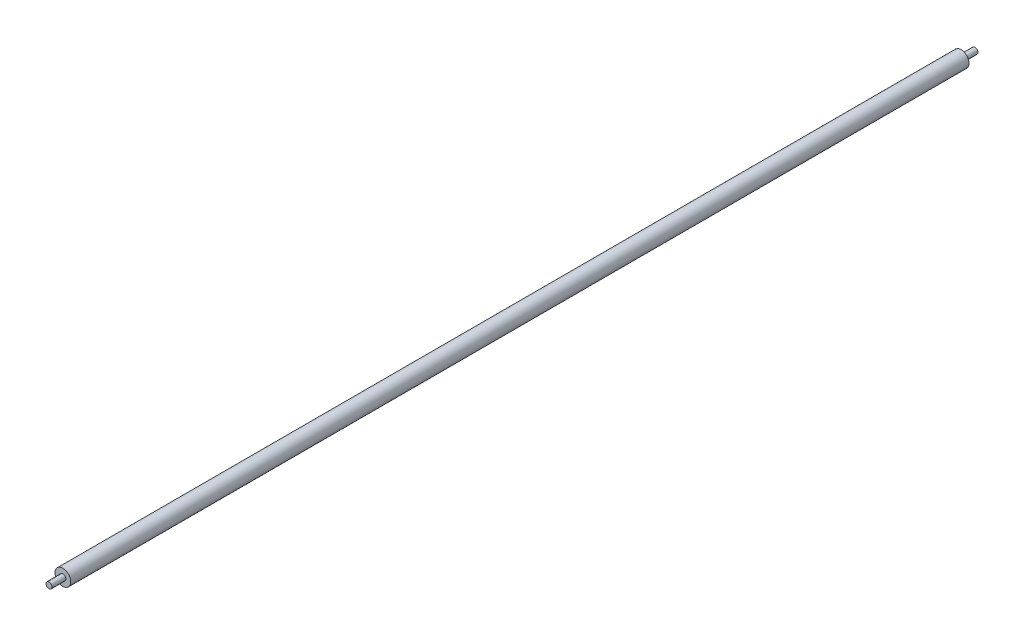
ISO-10303-21;
HEADER;
FILE_DESCRIPTION(('STEP AP214'),'2;1');
FILE_NAME('part.step','',(''),(''),'','','');
FILE_SCHEMA(('AUTOMOTIVE_DESIGN { 1 0 10303 214 1 1 1 1 }'));
ENDSEC;
DATA;
#1=APPLICATION_CONTEXT('core data for automotive mechanical design processes');
#2=APPLICATION_PROTOCOL_DEFINITION('international standard','automotive_design',2000,#1);
#3=PRODUCT_CONTEXT('',#1,'mechanical');
#4=PRODUCT('Part','Part','',(#3));
#5=PRODUCT_RELATED_PRODUCT_CATEGORY('part','',(#4));
#6=PRODUCT_DEFINITION_FORMATION('','',#4);
#7=PRODUCT_DEFINITION_CONTEXT('part definition',#1,'design');
#8=PRODUCT_DEFINITION('design','',#6,#7);
#9=PRODUCT_DEFINITION_SHAPE('','',#8);
#10=(LENGTH_UNIT() NAMED_UNIT(*) SI_UNIT(.MILLI.,.METRE.));
#11=(NAMED_UNIT(*) PLANE_ANGLE_UNIT() SI_UNIT($,.RADIAN.));
#12=(NAMED_UNIT(*) SI_UNIT($,.STERADIAN.) SOLID_ANGLE_UNIT());
#13=UNCERTAINTY_MEASURE_WITH_UNIT(LENGTH_MEASURE(1.E-05),#10,'distance_accuracy_value','');
#14=(GEOMETRIC_REPRESENTATION_CONTEXT(3) GLOBAL_UNCERTAINTY_ASSIGNED_CONTEXT((#13)) GLOBAL_UNIT_ASSIGNED_CONTEXT((#10,
#11,#12)) REPRESENTATION_CONTEXT('',''));
#15=CARTESIAN_POINT('',(0.,0.,0.));
#16=DIRECTION('',(0.,0.,1.));
#17=DIRECTION('',(1.,0.,0.));
#18=AXIS2_PLACEMENT_3D('',#15,#16,#17);
#19=CARTESIAN_POINT('',(0.,0.,102.404163056034));
#20=DIRECTION('',(0.,0.,-1.));
#21=DIRECTION('',(-1.,0.,0.));
#22=AXIS2_PLACEMENT_3D('',#19,#20,#21);
#23=CYLINDRICAL_SURFACE('',#22,0.85);
#24=CARTESIAN_POINT('',(0.,0.,1.5));
#25=DIRECTION('',(0.,0.,1.));
#26=DIRECTION('',(1.,0.,0.));
#27=AXIS2_PLACEMENT_3D('',#24,#25,#26);
#28=CIRCLE('',#27,0.85);
#29=CARTESIAN_POINT('',(-0.85,0.,1.49999999999999));
#30=VERTEX_POINT('',#29);
#31=EDGE_CURVE('E51',#30,#30,#28,.T.);
#32=CARTESIAN_POINT('',(0.,0.,98.5));
#33=DIRECTION('',(0.,0.,1.));
#34=DIRECTION('',(1.,0.,0.));
#35=AXIS2_PLACEMENT_3D('',#32,#33,#34);
#36=CIRCLE('',#35,0.85);
#37=CARTESIAN_POINT('',(-0.85,0.,98.5));
#38=VERTEX_POINT('',#37);
#39=EDGE_CURVE('E11',#38,#38,#36,.T.);
#40=CARTESIAN_POINT('',(-0.85,0.,1.49999999999999));
#41=CARTESIAN_POINT('',(-0.85,0.,2.51041666666665));
#42=CARTESIAN_POINT('',(-0.85,0.,3.52083333333332));
#43=CARTESIAN_POINT('',(-0.85,0.,5.54166666666665));
#44=CARTESIAN_POINT('',(-0.85,0.,6.55208333333332));
#45=CARTESIAN_POINT('',(-0.85,0.,8.57291666666665));
#46=CARTESIAN_POINT('',(-0.85,0.,9.58333333333332));
#47=CARTESIAN_POINT('',(-0.85,0.,11.6041666666667));
#48=CARTESIAN_POINT('',(-0.85,0.,12.6145833333333));
#49=CARTESIAN_POINT('',(-0.85,0.,14.6354166666667));
#50=CARTESIAN_POINT('',(-0.85,0.,15.6458333333333));
#51=CARTESIAN_POINT('',(-0.85,0.,17.6666666666667));
#52=CARTESIAN_POINT('',(-0.85,0.,18.6770833333333));
#53=CARTESIAN_POINT('',(-0.85,0.,20.6979166666667));
#54=CARTESIAN_POINT('',(-0.85,0.,21.7083333333333));
#55=CARTESIAN_POINT('',(-0.85,0.,23.7291666666667));
#56=CARTESIAN_POINT('',(-0.85,0.,24.7395833333333));
#57=CARTESIAN_POINT('',(-0.85,0.,26.7604166666667));
#58=CARTESIAN_POINT('',(-0.85,0.,27.7708333333333));
#59=CARTESIAN_POINT('',(-0.85,0.,29.7916666666667));
#60=CARTESIAN_POINT('',(-0.85,0.,30.8020833333333));
#61=CARTESIAN_POINT('',(-0.85,0.,32.8229166666667));
#62=CARTESIAN_POINT('',(-0.85,0.,33.8333333333333));
#63=CARTESIAN_POINT('',(-0.85,0.,35.8541666666667));
#64=CARTESIAN_POINT('',(-0.85,0.,36.8645833333333));
#65=CARTESIAN_POINT('',(-0.85,0.,38.8854166666667));
#66=CARTESIAN_POINT('',(-0.85,0.,39.8958333333333));
#67=CARTESIAN_POINT('',(-0.85,0.,41.9166666666667));
#68=CARTESIAN_POINT('',(-0.85,0.,42.9270833333333));
#69=CARTESIAN_POINT('',(-0.85,0.,44.9479166666667));
#70=CARTESIAN_POINT('',(-0.85,0.,45.9583333333333));
#71=CARTESIAN_POINT('',(-0.85,0.,47.9791666666667));
#72=CARTESIAN_POINT('',(-0.85,0.,48.9895833333333));
#73=CARTESIAN_POINT('',(-0.85,0.,51.0104166666667));
#74=CARTESIAN_POINT('',(-0.85,0.,52.0208333333333));
#75=CARTESIAN_POINT('',(-0.85,0.,54.0416666666667));
#76=CARTESIAN_POINT('',(-0.85,0.,55.0520833333333));
#77=CARTESIAN_POINT('',(-0.85,0.,57.0729166666667));
#78=CARTESIAN_POINT('',(-0.85,0.,58.0833333333333));
#79=CARTESIAN_POINT('',(-0.85,0.,60.1041666666667));
#80=CARTESIAN_POINT('',(-0.85,0.,61.1145833333333));
#81=CARTESIAN_POINT('',(-0.85,0.,63.1354166666667));
#82=CARTESIAN_POINT('',(-0.85,0.,64.1458333333333));
#83=CARTESIAN_POINT('',(-0.85,0.,66.1666666666667));
#84=CARTESIAN_POINT('',(-0.85,0.,67.1770833333333));
#85=CARTESIAN_POINT('',(-0.85,0.,69.1979166666667));
#86=CARTESIAN_POINT('',(-0.85,0.,70.2083333333333));
#87=CARTESIAN_POINT('',(-0.85,0.,72.2291666666666));
#88=CARTESIAN_POINT('',(-0.85,0.,73.2395833333333));
#89=CARTESIAN_POINT('',(-0.85,0.,75.2604166666666));
#90=CARTESIAN_POINT('',(-0.85,0.,76.2708333333333));
#91=CARTESIAN_POINT('',(-0.85,0.,78.2916666666666));
#92=CARTESIAN_POINT('',(-0.85,0.,79.3020833333333));
#93=CARTESIAN_POINT('',(-0.85,0.,81.3229166666666));
#94=CARTESIAN_POINT('',(-0.85,0.,82.3333333333333));
#95=CARTESIAN_POINT('',(-0.85,0.,84.3541666666667));
#96=CARTESIAN_POINT('',(-0.85,0.,85.3645833333333));
#97=CARTESIAN_POINT('',(-0.85,0.,87.3854166666667));
#98=CARTESIAN_POINT('',(-0.85,0.,88.3958333333333));
#99=CARTESIAN_POINT('',(-0.85,0.,90.4166666666667));
#100=CARTESIAN_POINT('',(-0.85,0.,91.4270833333333));
#101=CARTESIAN_POINT('',(-0.85,0.,93.4479166666667));
#102=CARTESIAN_POINT('',(-0.85,0.,94.4583333333333));
#103=CARTESIAN_POINT('',(-0.85,0.,96.4791666666667));
#104=CARTESIAN_POINT('',(-0.85,0.,97.4895833333333));
#105=CARTESIAN_POINT('',(-0.85,0.,98.5));
#106=B_SPLINE_CURVE_WITH_KNOTS('',3,(#40,#41,#42,#43,#44,#45,#46,#47,#48,#49,#50,#51,#52,#53,
#54,#55,#56,#57,#58,#59,#60,#61,#62,#63,#64,#65,#66,#67,#68,#69,#70,#71,#72,#73,#74,#75,#76,#77,
#78,#79,#80,#81,#82,#83,#84,#85,#86,#87,#88,#89,#90,#91,#92,#93,#94,#95,#96,#97,#98,#99,#100,
#101,#102,#103,#104,#105),.UNSPECIFIED.,.F.,.F.,(4,2,2,2,2,2,2,2,2,2,2,2,2,2,2,2,2,2,2,2,2,2,2,
2,2,2,2,2,2,2,2,2,4),(0.,3.03125,6.0625,9.09375,12.125,15.15625,18.1875,21.21875,24.25,27.28125,
30.3125,33.34375,36.375,39.40625,42.4375,45.46875,48.5,51.53125,54.5625,57.59375,60.625,
63.65625,66.6875,69.71875,72.75,75.78125,78.8125,81.84375,84.875,87.90625,90.9375,93.96875,97.),.UNSPECIFIED.);
#107=EDGE_CURVE('BSEAM44',#30,#38,#106,.T.);
#108=ORIENTED_EDGE('',*,*,#31,.T.);
#109=ORIENTED_EDGE('',*,*,#39,.F.);
#110=ORIENTED_EDGE('',*,*,#107,.T.);
#111=ORIENTED_EDGE('',*,*,#107,.F.);
#112=EDGE_LOOP('',(#108,#110,#109,#111));
#113=FACE_BOUND('',#112,.T.);
#114=ADVANCED_FACE('F44',(#113),#23,.T.);
#115=CARTESIAN_POINT('',(0.,0.,1.5));
#116=DIRECTION('',(0.,0.,1.));
#117=DIRECTION('',(1.,0.,0.));
#118=AXIS2_PLACEMENT_3D('',#115,#116,#117);
#119=PLANE('',#118);
#120=ORIENTED_EDGE('',*,*,#31,.F.);
#121=EDGE_LOOP('',(#120));
#122=FACE_BOUND('',#121,.T.);
#123=CARTESIAN_POINT('',(0.,0.,1.5));
#124=DIRECTION('',(0.,0.,1.));
#125=DIRECTION('',(1.,0.,0.));
#126=AXIS2_PLACEMENT_3D('',#123,#124,#125);
#127=CIRCLE('',#126,0.3219);
#128=CARTESIAN_POINT('',(0.3219,0.,1.5));
#129=VERTEX_POINT('',#128);
#130=EDGE_CURVE('E56',#129,#129,#127,.T.);
#131=ORIENTED_EDGE('',*,*,#130,.T.);
#132=EDGE_LOOP('',(#131));
#133=FACE_BOUND('',#132,.T.);
#134=ADVANCED_FACE('F72',(#122,#133),#119,.F.);
#135=CARTESIAN_POINT('',(0.,0.,102.404163056034));
#136=DIRECTION('',(0.,0.,-1.));
#137=DIRECTION('',(-1.,0.,0.));
#138=AXIS2_PLACEMENT_3D('',#135,#136,#137);
#139=CYLINDRICAL_SURFACE('',#138,0.3219);
#140=ORIENTED_EDGE('',*,*,#130,.F.);
#141=EDGE_LOOP('',(#140));
#142=FACE_BOUND('',#141,.T.);
#143=CARTESIAN_POINT('',(0.,0.,98.5));
#144=DIRECTION('',(0.,0.,1.));
#145=DIRECTION('',(1.,0.,0.));
#146=AXIS2_PLACEMENT_3D('',#143,#144,#145);
#147=CIRCLE('',#146,0.3219);
#148=CARTESIAN_POINT('',(0.3219,0.,98.5));
#149=VERTEX_POINT('',#148);
#150=EDGE_CURVE('E47',#149,#149,#147,.T.);
#151=ORIENTED_EDGE('',*,*,#150,.T.);
#152=EDGE_LOOP('',(#151));
#153=FACE_BOUND('',#152,.T.);
#154=ADVANCED_FACE('F64',(#142,#153),#139,.F.);
#155=CARTESIAN_POINT('',(0.,0.,98.5));
#156=DIRECTION('',(0.,0.,1.));
#157=DIRECTION('',(1.,0.,0.));
#158=AXIS2_PLACEMENT_3D('',#155,#156,#157);
#159=PLANE('',#158);
#160=ORIENTED_EDGE('',*,*,#150,.F.);
#161=EDGE_LOOP('',(#160));
#162=FACE_BOUND('',#161,.T.);
#163=ORIENTED_EDGE('',*,*,#39,.T.);
#164=EDGE_LOOP('',(#163));
#165=FACE_BOUND('',#164,.T.);
#166=ADVANCED_FACE('F66',(#162,#165),#159,.T.);
#167=CLOSED_SHELL('',(#114,#134,#154,#166));
#168=MANIFOLD_SOLID_BREP('B2',#167);
#169=CARTESIAN_POINT('',(0.,0.,100.));
#170=DIRECTION('',(0.,0.,-1.));
#171=DIRECTION('',(-1.,0.,0.));
#172=AXIS2_PLACEMENT_3D('',#169,#170,#171);
#173=CYLINDRICAL_SURFACE('',#172,0.3219);
#174=CARTESIAN_POINT('',(0.,0.,100.));
#175=DIRECTION('',(0.,0.,1.));
#176=DIRECTION('',(1.,0.,0.));
#177=AXIS2_PLACEMENT_3D('',#174,#175,#176);
#178=CIRCLE('',#177,0.3219);
#179=CARTESIAN_POINT('',(0.3219,0.,100.));
#180=VERTEX_POINT('',#179);
#181=EDGE_CURVE('E43',#180,#180,#178,.T.);
#182=ORIENTED_EDGE('',*,*,#181,.F.);
#183=EDGE_LOOP('',(#182));
#184=FACE_BOUND('',#183,.T.);
#185=CARTESIAN_POINT('',(0.,0.,0.));
#186=DIRECTION('',(0.,0.,1.));
#187=DIRECTION('',(1.,0.,0.));
#188=AXIS2_PLACEMENT_3D('',#185,#186,#187);
#189=CIRCLE('',#188,0.3219);
#190=CARTESIAN_POINT('',(0.3219,0.,0.));
#191=VERTEX_POINT('',#190);
#192=EDGE_CURVE('E110',#191,#191,#189,.T.);
#193=ORIENTED_EDGE('',*,*,#192,.T.);
#194=EDGE_LOOP('',(#193));
#195=FACE_BOUND('',#194,.T.);
#196=ADVANCED_FACE('F107',(#184,#195),#173,.T.);
#197=CARTESIAN_POINT('',(0.,0.,100.));
#198=DIRECTION('',(0.,0.,1.));
#199=DIRECTION('',(1.,0.,0.));
#200=AXIS2_PLACEMENT_3D('',#197,#198,#199);
#201=PLANE('',#200);
#202=ORIENTED_EDGE('',*,*,#181,.T.);
#203=EDGE_LOOP('',(#202));
#204=FACE_BOUND('',#203,.T.);
#205=ADVANCED_FACE('F122',(#204),#201,.T.);
#206=CARTESIAN_POINT('',(0.,0.,0.));
#207=DIRECTION('',(0.,0.,1.));
#208=DIRECTION('',(1.,0.,0.));
#209=AXIS2_PLACEMENT_3D('',#206,#207,#208);
#210=PLANE('',#209);
#211=ORIENTED_EDGE('',*,*,#192,.F.);
#212=EDGE_LOOP('',(#211));
#213=FACE_BOUND('',#212,.T.);
#214=ADVANCED_FACE('F120',(#213),#210,.F.);
#215=CLOSED_SHELL('',(#196,#205,#214));
#216=MANIFOLD_SOLID_BREP('B6',#215);
#217=ADVANCED_BREP_SHAPE_REPRESENTATION('',(#18,#168,#216),#14);
#218=SHAPE_DEFINITION_REPRESENTATION(#9,#217);
ENDSEC;
END-ISO-10303-21;
